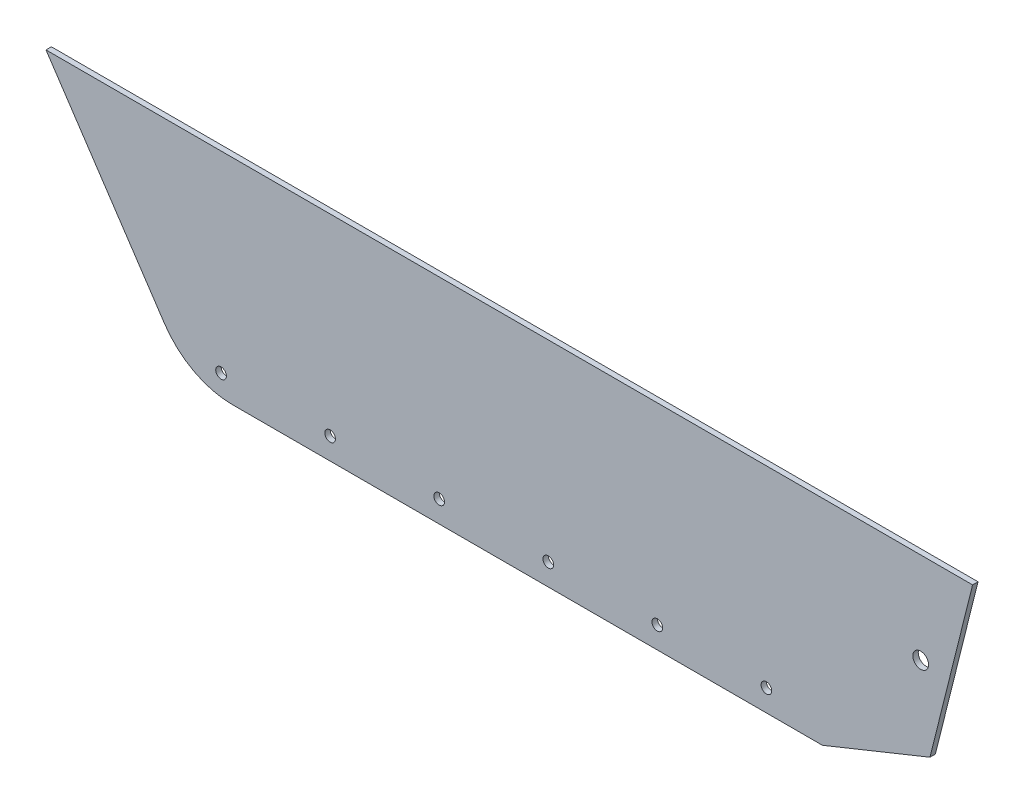
ISO-10303-21;
HEADER;
FILE_DESCRIPTION(('STEP AP214'),'2;1');
FILE_NAME('part.step','',(''),(''),'','','');
FILE_SCHEMA(('AUTOMOTIVE_DESIGN { 1 0 10303 214 1 1 1 1 }'));
ENDSEC;
DATA;
#1=APPLICATION_CONTEXT('core data for automotive mechanical design processes');
#2=APPLICATION_PROTOCOL_DEFINITION('international standard','automotive_design',2000,#1);
#3=PRODUCT_CONTEXT('',#1,'mechanical');
#4=PRODUCT('Part','Part','',(#3));
#5=PRODUCT_RELATED_PRODUCT_CATEGORY('part','',(#4));
#6=PRODUCT_DEFINITION_FORMATION('','',#4);
#7=PRODUCT_DEFINITION_CONTEXT('part definition',#1,'design');
#8=PRODUCT_DEFINITION('design','',#6,#7);
#9=PRODUCT_DEFINITION_SHAPE('','',#8);
#10=(LENGTH_UNIT() NAMED_UNIT(*) SI_UNIT(.MILLI.,.METRE.));
#11=(NAMED_UNIT(*) PLANE_ANGLE_UNIT() SI_UNIT($,.RADIAN.));
#12=(NAMED_UNIT(*) SI_UNIT($,.STERADIAN.) SOLID_ANGLE_UNIT());
#13=UNCERTAINTY_MEASURE_WITH_UNIT(LENGTH_MEASURE(1.E-05),#10,'distance_accuracy_value','');
#14=(GEOMETRIC_REPRESENTATION_CONTEXT(3) GLOBAL_UNCERTAINTY_ASSIGNED_CONTEXT((#13)) GLOBAL_UNIT_ASSIGNED_CONTEXT((#10,
#11,#12)) REPRESENTATION_CONTEXT('',''));
#15=CARTESIAN_POINT('',(0.,0.,0.));
#16=DIRECTION('',(0.,0.,1.));
#17=DIRECTION('',(1.,0.,0.));
#18=AXIS2_PLACEMENT_3D('',#15,#16,#17);
#19=CARTESIAN_POINT('',(-31.8794117647059,-96.6490196078432,3.175));
#20=DIRECTION('',(0.,1.,0.));
#21=DIRECTION('',(-1.,0.,0.));
#22=AXIS2_PLACEMENT_3D('',#19,#20,#21);
#23=PLANE('',#22);
#24=DIRECTION('',(1.,0.,0.));
#25=VECTOR('',#24,1.);
#26=CARTESIAN_POINT('',(-31.8794117647059,-96.6490196078432,0.));
#27=LINE('',#26,#25);
#28=CARTESIAN_POINT('',(-6.19059135728281,-96.6490196078432,0.));
#29=VERTEX_POINT('',#28);
#30=CARTESIAN_POINT('',(340.005873473177,-96.6490196078432,0.));
#31=VERTEX_POINT('',#30);
#32=EDGE_CURVE('E135',#29,#31,#27,.T.);
#33=ORIENTED_EDGE('',*,*,#32,.T.);
#34=DIRECTION('',(0.,0.,1.));
#35=VECTOR('',#34,1.);
#36=CARTESIAN_POINT('',(340.005873473177,-96.6490196078432,-6.825));
#37=LINE('',#36,#35);
#38=CARTESIAN_POINT('',(340.005873473177,-96.6490196078432,3.175));
#39=VERTEX_POINT('',#38);
#40=EDGE_CURVE('E62',#31,#39,#37,.T.);
#41=ORIENTED_EDGE('',*,*,#40,.T.);
#42=DIRECTION('',(1.,0.,0.));
#43=VECTOR('',#42,1.);
#44=CARTESIAN_POINT('',(-31.8794117647059,-96.6490196078432,3.175));
#45=LINE('',#44,#43);
#46=CARTESIAN_POINT('',(-6.19059135728281,-96.6490196078432,3.175));
#47=VERTEX_POINT('',#46);
#48=EDGE_CURVE('E119',#47,#39,#45,.T.);
#49=ORIENTED_EDGE('',*,*,#48,.F.);
#50=DIRECTION('',(0.,0.,-1.));
#51=VECTOR('',#50,1.);
#52=CARTESIAN_POINT('',(-6.19059135728281,-96.6490196078432,0.));
#53=LINE('',#52,#51);
#54=EDGE_CURVE('E108',#47,#29,#53,.T.);
#55=ORIENTED_EDGE('',*,*,#54,.T.);
#56=EDGE_LOOP('',(#33,#41,#49,#55));
#57=FACE_BOUND('',#56,.T.);
#58=ADVANCED_FACE('F47',(#57),#23,.F.);
#59=CARTESIAN_POINT('',(428.120588235294,28.9396179466764,3.175));
#60=DIRECTION('',(0.970193019893108,-0.242333456523632,0.));
#61=DIRECTION('',(0.242333456523632,0.970193019893108,0.));
#62=AXIS2_PLACEMENT_3D('',#59,#60,#61);
#63=PLANE('',#62);
#64=DIRECTION('',(-0.242333456523632,-0.970193019893108,0.));
#65=VECTOR('',#64,1.);
#66=CARTESIAN_POINT('',(428.120588235294,28.9396179466764,0.));
#67=LINE('',#66,#65);
#68=CARTESIAN_POINT('',(428.120588235294,28.9396179466764,0.));
#69=VERTEX_POINT('',#68);
#70=CARTESIAN_POINT('',(403.120588235294,-71.1490196078431,0.));
#71=VERTEX_POINT('',#70);
#72=EDGE_CURVE('E139',#69,#71,#67,.T.);
#73=ORIENTED_EDGE('',*,*,#72,.F.);
#74=DIRECTION('',(0.,0.,-1.));
#75=VECTOR('',#74,1.);
#76=CARTESIAN_POINT('',(428.120588235294,28.9396179466764,3.175));
#77=LINE('',#76,#75);
#78=CARTESIAN_POINT('',(428.120588235294,28.9396179466764,3.175));
#79=VERTEX_POINT('',#78);
#80=EDGE_CURVE('E109',#79,#69,#77,.T.);
#81=ORIENTED_EDGE('',*,*,#80,.F.);
#82=DIRECTION('',(-0.242333456523632,-0.970193019893108,0.));
#83=VECTOR('',#82,1.);
#84=CARTESIAN_POINT('',(428.120588235294,28.9396179466764,3.175));
#85=LINE('',#84,#83);
#86=CARTESIAN_POINT('',(403.120588235294,-71.1490196078431,3.175));
#87=VERTEX_POINT('',#86);
#88=EDGE_CURVE('E116',#79,#87,#85,.T.);
#89=ORIENTED_EDGE('',*,*,#88,.T.);
#90=DIRECTION('',(0.,0.,-1.));
#91=VECTOR('',#90,1.);
#92=CARTESIAN_POINT('',(403.120588235294,-71.1490196078431,3.175));
#93=LINE('',#92,#91);
#94=EDGE_CURVE('E99',#87,#71,#93,.T.);
#95=ORIENTED_EDGE('',*,*,#94,.T.);
#96=EDGE_LOOP('',(#73,#81,#89,#95));
#97=FACE_BOUND('',#96,.T.);
#98=ADVANCED_FACE('F123',(#97),#63,.T.);
#99=CARTESIAN_POINT('',(-115.605170134385,28.9396179466764,3.175));
#100=DIRECTION('',(0.,1.,0.));
#101=DIRECTION('',(-1.,0.,0.));
#102=AXIS2_PLACEMENT_3D('',#99,#100,#101);
#103=PLANE('',#102);
#104=DIRECTION('',(1.,0.,0.));
#105=VECTOR('',#104,1.);
#106=CARTESIAN_POINT('',(-115.605170134385,28.9396179466764,0.));
#107=LINE('',#106,#105);
#108=CARTESIAN_POINT('',(-115.605170134385,28.9396179466764,0.));
#109=VERTEX_POINT('',#108);
#110=EDGE_CURVE('E143',#109,#69,#107,.T.);
#111=ORIENTED_EDGE('',*,*,#110,.F.);
#112=DIRECTION('',(0.,0.,-1.));
#113=VECTOR('',#112,1.);
#114=CARTESIAN_POINT('',(-115.605170134385,28.9396179466764,3.175));
#115=LINE('',#114,#113);
#116=CARTESIAN_POINT('',(-115.605170134385,28.9396179466764,3.175));
#117=VERTEX_POINT('',#116);
#118=EDGE_CURVE('E129',#117,#109,#115,.T.);
#119=ORIENTED_EDGE('',*,*,#118,.F.);
#120=DIRECTION('',(1.,0.,0.));
#121=VECTOR('',#120,1.);
#122=CARTESIAN_POINT('',(-115.605170134385,28.9396179466764,3.175));
#123=LINE('',#122,#121);
#124=EDGE_CURVE('E125',#117,#79,#123,.T.);
#125=ORIENTED_EDGE('',*,*,#124,.T.);
#126=ORIENTED_EDGE('',*,*,#80,.T.);
#127=EDGE_LOOP('',(#111,#119,#125,#126));
#128=FACE_BOUND('',#127,.T.);
#129=ADVANCED_FACE('F175',(#128),#103,.T.);
#130=CARTESIAN_POINT('',(-98.8794117647059,3.85098039215685,3.175));
#131=DIRECTION('',(-0.832050294337848,-0.554700196225223,0.));
#132=DIRECTION('',(0.554700196225223,-0.832050294337848,0.));
#133=AXIS2_PLACEMENT_3D('',#130,#131,#132);
#134=PLANE('',#133);
#135=DIRECTION('',(-0.554700196225223,0.832050294337848,0.));
#136=VECTOR('',#135,1.);
#137=CARTESIAN_POINT('',(-98.8794117647059,3.85098039215685,0.));
#138=LINE('',#137,#136);
#139=CARTESIAN_POINT('',(-46.1290054854995,-75.2746290266539,0.));
#140=VERTEX_POINT('',#139);
#141=EDGE_CURVE('E147',#140,#109,#138,.T.);
#142=ORIENTED_EDGE('',*,*,#141,.F.);
#143=DIRECTION('',(0.,0.,-1.));
#144=VECTOR('',#143,1.);
#145=CARTESIAN_POINT('',(-46.1290054854995,-75.2746290266539,3.175));
#146=LINE('',#145,#144);
#147=CARTESIAN_POINT('',(-46.129005485499,-75.2746290266536,3.175));
#148=VERTEX_POINT('',#147);
#149=EDGE_CURVE('E70',#140,#148,#146,.F.);
#150=ORIENTED_EDGE('',*,*,#149,.T.);
#151=DIRECTION('',(0.554700196225229,-0.832050294337844,0.));
#152=VECTOR('',#151,1.);
#153=CARTESIAN_POINT('',(-98.8794117647059,3.85098039215685,3.175));
#154=LINE('',#153,#152);
#155=EDGE_CURVE('E131',#117,#148,#154,.T.);
#156=ORIENTED_EDGE('',*,*,#155,.F.);
#157=ORIENTED_EDGE('',*,*,#118,.T.);
#158=EDGE_LOOP('',(#142,#150,#156,#157));
#159=FACE_BOUND('',#158,.T.);
#160=ADVANCED_FACE('F171',(#159),#134,.T.);
#161=CARTESIAN_POINT('',(0.,0.,3.175));
#162=DIRECTION('',(0.,0.,-1.));
#163=DIRECTION('',(-1.,0.,0.));
#164=AXIS2_PLACEMENT_3D('',#161,#162,#163);
#165=PLANE('',#164);
#166=CARTESIAN_POINT('',(397.677759779101,-24.6104058558157,3.175));
#167=DIRECTION('',(0.,0.,1.));
#168=DIRECTION('',(1.,0.,0.));
#169=AXIS2_PLACEMENT_3D('',#166,#167,#168);
#170=CIRCLE('',#169,4.62499999999997);
#171=CARTESIAN_POINT('',(402.302759779101,-24.6104058558157,3.175));
#172=VERTEX_POINT('',#171);
#173=EDGE_CURVE('E121',#172,#172,#170,.T.);
#174=ORIENTED_EDGE('',*,*,#173,.F.);
#175=EDGE_LOOP('',(#174));
#176=FACE_BOUND('',#175,.T.);
#177=CARTESIAN_POINT('',(-12.8794117647059,-83.8990196078432,3.175));
#178=DIRECTION('',(0.,0.,1.));
#179=DIRECTION('',(1.,0.,0.));
#180=AXIS2_PLACEMENT_3D('',#177,#178,#179);
#181=CIRCLE('',#180,3.125);
#182=CARTESIAN_POINT('',(-9.75441176470592,-83.8990196078432,3.175));
#183=VERTEX_POINT('',#182);
#184=EDGE_CURVE('E140',#183,#183,#181,.T.);
#185=ORIENTED_EDGE('',*,*,#184,.F.);
#186=EDGE_LOOP('',(#185));
#187=FACE_BOUND('',#186,.T.);
#188=CARTESIAN_POINT('',(51.1205882352941,-83.8990196078433,3.175));
#189=DIRECTION('',(0.,0.,1.));
#190=DIRECTION('',(1.,0.,0.));
#191=AXIS2_PLACEMENT_3D('',#188,#189,#190);
#192=CIRCLE('',#191,3.125);
#193=CARTESIAN_POINT('',(54.2455882352941,-83.8990196078433,3.175));
#194=VERTEX_POINT('',#193);
#195=EDGE_CURVE('E343',#194,#194,#192,.T.);
#196=ORIENTED_EDGE('',*,*,#195,.F.);
#197=EDGE_LOOP('',(#196));
#198=FACE_BOUND('',#197,.T.);
#199=CARTESIAN_POINT('',(115.120588235294,-83.8990196078432,3.175));
#200=DIRECTION('',(0.,0.,1.));
#201=DIRECTION('',(1.,0.,0.));
#202=AXIS2_PLACEMENT_3D('',#199,#200,#201);
#203=CIRCLE('',#202,3.125);
#204=CARTESIAN_POINT('',(118.245588235294,-83.8990196078432,3.175));
#205=VERTEX_POINT('',#204);
#206=EDGE_CURVE('E351',#205,#205,#203,.T.);
#207=ORIENTED_EDGE('',*,*,#206,.F.);
#208=EDGE_LOOP('',(#207));
#209=FACE_BOUND('',#208,.T.);
#210=CARTESIAN_POINT('',(179.120588235294,-83.8990196078432,3.175));
#211=DIRECTION('',(0.,0.,1.));
#212=DIRECTION('',(1.,0.,0.));
#213=AXIS2_PLACEMENT_3D('',#210,#211,#212);
#214=CIRCLE('',#213,3.125);
#215=CARTESIAN_POINT('',(182.245588235294,-83.8990196078432,3.175));
#216=VERTEX_POINT('',#215);
#217=EDGE_CURVE('E359',#216,#216,#214,.T.);
#218=ORIENTED_EDGE('',*,*,#217,.F.);
#219=EDGE_LOOP('',(#218));
#220=FACE_BOUND('',#219,.T.);
#221=CARTESIAN_POINT('',(243.120588235294,-83.8990196078432,3.175));
#222=DIRECTION('',(0.,0.,1.));
#223=DIRECTION('',(1.,0.,0.));
#224=AXIS2_PLACEMENT_3D('',#221,#222,#223);
#225=CIRCLE('',#224,3.125);
#226=CARTESIAN_POINT('',(246.245588235294,-83.8990196078432,3.175));
#227=VERTEX_POINT('',#226);
#228=EDGE_CURVE('E322',#227,#227,#225,.T.);
#229=ORIENTED_EDGE('',*,*,#228,.F.);
#230=EDGE_LOOP('',(#229));
#231=FACE_BOUND('',#230,.T.);
#232=CARTESIAN_POINT('',(307.120588235294,-83.8990196078432,3.175));
#233=DIRECTION('',(0.,0.,1.));
#234=DIRECTION('',(1.,0.,0.));
#235=AXIS2_PLACEMENT_3D('',#232,#233,#234);
#236=CIRCLE('',#235,3.125);
#237=CARTESIAN_POINT('',(310.245588235294,-83.8990196078432,3.175));
#238=VERTEX_POINT('',#237);
#239=EDGE_CURVE('E316',#238,#238,#236,.T.);
#240=ORIENTED_EDGE('',*,*,#239,.F.);
#241=EDGE_LOOP('',(#240));
#242=FACE_BOUND('',#241,.T.);
#243=ORIENTED_EDGE('',*,*,#48,.T.);
#244=DIRECTION('',(-0.92718385456679,-0.374606593415906,0.));
#245=VECTOR('',#244,1.);
#246=CARTESIAN_POINT('',(403.120588235294,-71.1490196078431,3.175));
#247=LINE('',#246,#245);
#248=EDGE_CURVE('E102',#87,#39,#247,.T.);
#249=ORIENTED_EDGE('',*,*,#248,.F.);
#250=ORIENTED_EDGE('',*,*,#88,.F.);
#251=ORIENTED_EDGE('',*,*,#124,.F.);
#252=ORIENTED_EDGE('',*,*,#155,.T.);
#253=CARTESIAN_POINT('',(-6.19059135728282,-48.6490196078432,3.175));
#254=DIRECTION('',(0.,0.,-1.));
#255=DIRECTION('',(-1.,0.,0.));
#256=AXIS2_PLACEMENT_3D('',#253,#254,#255);
#257=CIRCLE('',#256,48.);
#258=EDGE_CURVE('E56',#148,#47,#257,.F.);
#259=ORIENTED_EDGE('',*,*,#258,.T.);
#260=EDGE_LOOP('',(#243,#249,#250,#251,#252,#259));
#261=FACE_BOUND('',#260,.T.);
#262=ADVANCED_FACE('F114',(#176,#187,#198,#209,#220,#231,#242,#261),#165,.F.);
#263=CARTESIAN_POINT('',(0.,0.,0.));
#264=DIRECTION('',(0.,0.,-1.));
#265=DIRECTION('',(-1.,0.,0.));
#266=AXIS2_PLACEMENT_3D('',#263,#264,#265);
#267=PLANE('',#266);
#268=CARTESIAN_POINT('',(397.677759779101,-24.6104058558157,0.));
#269=DIRECTION('',(0.,0.,-1.));
#270=DIRECTION('',(-1.,0.,0.));
#271=AXIS2_PLACEMENT_3D('',#268,#269,#270);
#272=CIRCLE('',#271,4.62499999999997);
#273=CARTESIAN_POINT('',(393.052759779101,-24.6104058558157,0.));
#274=VERTEX_POINT('',#273);
#275=EDGE_CURVE('E370',#274,#274,#272,.F.);
#276=ORIENTED_EDGE('',*,*,#275,.T.);
#277=EDGE_LOOP('',(#276));
#278=FACE_BOUND('',#277,.T.);
#279=DIRECTION('',(0.92718385456679,0.374606593415906,0.));
#280=VECTOR('',#279,1.);
#281=CARTESIAN_POINT('',(81.2820834011268,-201.180216044419,0.));
#282=LINE('',#281,#280);
#283=EDGE_CURVE('E11',#31,#71,#282,.T.);
#284=ORIENTED_EDGE('',*,*,#283,.F.);
#285=ORIENTED_EDGE('',*,*,#32,.F.);
#286=CARTESIAN_POINT('',(-6.19059135728282,-48.6490196078432,0.));
#287=DIRECTION('',(0.,0.,-1.));
#288=DIRECTION('',(-1.,0.,0.));
#289=AXIS2_PLACEMENT_3D('',#286,#287,#288);
#290=CIRCLE('',#289,48.);
#291=EDGE_CURVE('E158',#29,#140,#290,.T.);
#292=ORIENTED_EDGE('',*,*,#291,.T.);
#293=ORIENTED_EDGE('',*,*,#141,.T.);
#294=ORIENTED_EDGE('',*,*,#110,.T.);
#295=ORIENTED_EDGE('',*,*,#72,.T.);
#296=EDGE_LOOP('',(#284,#285,#292,#293,#294,#295));
#297=FACE_BOUND('',#296,.T.);
#298=CARTESIAN_POINT('',(-12.8794117647059,-83.8990196078432,0.));
#299=DIRECTION('',(0.,0.,1.));
#300=DIRECTION('',(1.,0.,0.));
#301=AXIS2_PLACEMENT_3D('',#298,#299,#300);
#302=CIRCLE('',#301,3.125);
#303=CARTESIAN_POINT('',(-9.75441176470592,-83.8990196078432,0.));
#304=VERTEX_POINT('',#303);
#305=EDGE_CURVE('E335',#304,#304,#302,.T.);
#306=ORIENTED_EDGE('',*,*,#305,.T.);
#307=EDGE_LOOP('',(#306));
#308=FACE_BOUND('',#307,.T.);
#309=CARTESIAN_POINT('',(51.1205882352941,-83.8990196078433,0.));
#310=DIRECTION('',(0.,0.,1.));
#311=DIRECTION('',(1.,0.,0.));
#312=AXIS2_PLACEMENT_3D('',#309,#310,#311);
#313=CIRCLE('',#312,3.125);
#314=CARTESIAN_POINT('',(54.2455882352941,-83.8990196078433,0.));
#315=VERTEX_POINT('',#314);
#316=EDGE_CURVE('E339',#315,#315,#313,.T.);
#317=ORIENTED_EDGE('',*,*,#316,.T.);
#318=EDGE_LOOP('',(#317));
#319=FACE_BOUND('',#318,.T.);
#320=CARTESIAN_POINT('',(115.120588235294,-83.8990196078432,0.));
#321=DIRECTION('',(0.,0.,1.));
#322=DIRECTION('',(1.,0.,0.));
#323=AXIS2_PLACEMENT_3D('',#320,#321,#322);
#324=CIRCLE('',#323,3.125);
#325=CARTESIAN_POINT('',(118.245588235294,-83.8990196078432,0.));
#326=VERTEX_POINT('',#325);
#327=EDGE_CURVE('E347',#326,#326,#324,.T.);
#328=ORIENTED_EDGE('',*,*,#327,.T.);
#329=EDGE_LOOP('',(#328));
#330=FACE_BOUND('',#329,.T.);
#331=CARTESIAN_POINT('',(179.120588235294,-83.8990196078432,0.));
#332=DIRECTION('',(0.,0.,1.));
#333=DIRECTION('',(1.,0.,0.));
#334=AXIS2_PLACEMENT_3D('',#331,#332,#333);
#335=CIRCLE('',#334,3.125);
#336=CARTESIAN_POINT('',(182.245588235294,-83.8990196078432,0.));
#337=VERTEX_POINT('',#336);
#338=EDGE_CURVE('E355',#337,#337,#335,.T.);
#339=ORIENTED_EDGE('',*,*,#338,.T.);
#340=EDGE_LOOP('',(#339));
#341=FACE_BOUND('',#340,.T.);
#342=CARTESIAN_POINT('',(243.120588235294,-83.8990196078432,0.));
#343=DIRECTION('',(0.,0.,1.));
#344=DIRECTION('',(1.,0.,0.));
#345=AXIS2_PLACEMENT_3D('',#342,#343,#344);
#346=CIRCLE('',#345,3.125);
#347=CARTESIAN_POINT('',(246.245588235294,-83.8990196078432,0.));
#348=VERTEX_POINT('',#347);
#349=EDGE_CURVE('E327',#348,#348,#346,.T.);
#350=ORIENTED_EDGE('',*,*,#349,.T.);
#351=EDGE_LOOP('',(#350));
#352=FACE_BOUND('',#351,.T.);
#353=CARTESIAN_POINT('',(307.120588235294,-83.8990196078432,0.));
#354=DIRECTION('',(0.,0.,1.));
#355=DIRECTION('',(1.,0.,0.));
#356=AXIS2_PLACEMENT_3D('',#353,#354,#355);
#357=CIRCLE('',#356,3.125);
#358=CARTESIAN_POINT('',(310.245588235294,-83.8990196078432,0.));
#359=VERTEX_POINT('',#358);
#360=EDGE_CURVE('E319',#359,#359,#357,.T.);
#361=ORIENTED_EDGE('',*,*,#360,.T.);
#362=EDGE_LOOP('',(#361));
#363=FACE_BOUND('',#362,.T.);
#364=ADVANCED_FACE('F169',(#278,#297,#308,#319,#330,#341,#352,#363),#267,.T.);
#365=CARTESIAN_POINT('',(307.120588235294,-83.8990196078432,3.175));
#366=DIRECTION('',(0.,0.,-1.));
#367=DIRECTION('',(-1.,0.,0.));
#368=AXIS2_PLACEMENT_3D('',#365,#366,#367);
#369=CYLINDRICAL_SURFACE('',#368,3.125);
#370=ORIENTED_EDGE('',*,*,#239,.T.);
#371=EDGE_LOOP('',(#370));
#372=FACE_BOUND('',#371,.T.);
#373=ORIENTED_EDGE('',*,*,#360,.F.);
#374=EDGE_LOOP('',(#373));
#375=FACE_BOUND('',#374,.T.);
#376=ADVANCED_FACE('F221',(#372,#375),#369,.F.);
#377=CARTESIAN_POINT('',(243.120588235294,-83.8990196078432,3.175));
#378=DIRECTION('',(0.,0.,-1.));
#379=DIRECTION('',(-1.,0.,0.));
#380=AXIS2_PLACEMENT_3D('',#377,#378,#379);
#381=CYLINDRICAL_SURFACE('',#380,3.125);
#382=ORIENTED_EDGE('',*,*,#228,.T.);
#383=EDGE_LOOP('',(#382));
#384=FACE_BOUND('',#383,.T.);
#385=ORIENTED_EDGE('',*,*,#349,.F.);
#386=EDGE_LOOP('',(#385));
#387=FACE_BOUND('',#386,.T.);
#388=ADVANCED_FACE('F273',(#384,#387),#381,.F.);
#389=CARTESIAN_POINT('',(179.120588235294,-83.8990196078432,3.175));
#390=DIRECTION('',(0.,0.,-1.));
#391=DIRECTION('',(-1.,0.,0.));
#392=AXIS2_PLACEMENT_3D('',#389,#390,#391);
#393=CYLINDRICAL_SURFACE('',#392,3.125);
#394=ORIENTED_EDGE('',*,*,#217,.T.);
#395=EDGE_LOOP('',(#394));
#396=FACE_BOUND('',#395,.T.);
#397=ORIENTED_EDGE('',*,*,#338,.F.);
#398=EDGE_LOOP('',(#397));
#399=FACE_BOUND('',#398,.T.);
#400=ADVANCED_FACE('F264',(#396,#399),#393,.F.);
#401=CARTESIAN_POINT('',(115.120588235294,-83.8990196078432,3.175));
#402=DIRECTION('',(0.,0.,-1.));
#403=DIRECTION('',(-1.,0.,0.));
#404=AXIS2_PLACEMENT_3D('',#401,#402,#403);
#405=CYLINDRICAL_SURFACE('',#404,3.125);
#406=ORIENTED_EDGE('',*,*,#206,.T.);
#407=EDGE_LOOP('',(#406));
#408=FACE_BOUND('',#407,.T.);
#409=ORIENTED_EDGE('',*,*,#327,.F.);
#410=EDGE_LOOP('',(#409));
#411=FACE_BOUND('',#410,.T.);
#412=ADVANCED_FACE('F255',(#408,#411),#405,.F.);
#413=CARTESIAN_POINT('',(51.1205882352941,-83.8990196078433,3.175));
#414=DIRECTION('',(0.,0.,-1.));
#415=DIRECTION('',(-1.,0.,0.));
#416=AXIS2_PLACEMENT_3D('',#413,#414,#415);
#417=CYLINDRICAL_SURFACE('',#416,3.125);
#418=ORIENTED_EDGE('',*,*,#195,.T.);
#419=EDGE_LOOP('',(#418));
#420=FACE_BOUND('',#419,.T.);
#421=ORIENTED_EDGE('',*,*,#316,.F.);
#422=EDGE_LOOP('',(#421));
#423=FACE_BOUND('',#422,.T.);
#424=ADVANCED_FACE('F246',(#420,#423),#417,.F.);
#425=CARTESIAN_POINT('',(-12.8794117647059,-83.8990196078432,3.175));
#426=DIRECTION('',(0.,0.,-1.));
#427=DIRECTION('',(-1.,0.,0.));
#428=AXIS2_PLACEMENT_3D('',#425,#426,#427);
#429=CYLINDRICAL_SURFACE('',#428,3.125);
#430=ORIENTED_EDGE('',*,*,#184,.T.);
#431=EDGE_LOOP('',(#430));
#432=FACE_BOUND('',#431,.T.);
#433=ORIENTED_EDGE('',*,*,#305,.F.);
#434=EDGE_LOOP('',(#433));
#435=FACE_BOUND('',#434,.T.);
#436=ADVANCED_FACE('F239',(#432,#435),#429,.F.);
#437=CARTESIAN_POINT('',(-6.19059135728282,-48.6490196078432,3.175));
#438=DIRECTION('',(0.,0.,1.));
#439=DIRECTION('',(1.,0.,0.));
#440=AXIS2_PLACEMENT_3D('',#437,#438,#439);
#441=CYLINDRICAL_SURFACE('',#440,48.);
#442=ORIENTED_EDGE('',*,*,#258,.F.);
#443=ORIENTED_EDGE('',*,*,#149,.F.);
#444=ORIENTED_EDGE('',*,*,#291,.F.);
#445=ORIENTED_EDGE('',*,*,#54,.F.);
#446=EDGE_LOOP('',(#442,#443,#444,#445));
#447=FACE_BOUND('',#446,.T.);
#448=ADVANCED_FACE('F49',(#447),#441,.T.);
#449=CARTESIAN_POINT('',(403.120588235294,-71.1490196078431,-6.825));
#450=DIRECTION('',(-0.374606593415906,0.92718385456679,0.));
#451=DIRECTION('',(-0.92718385456679,-0.374606593415906,0.));
#452=AXIS2_PLACEMENT_3D('',#449,#450,#451);
#453=PLANE('',#452);
#454=ORIENTED_EDGE('',*,*,#283,.T.);
#455=ORIENTED_EDGE('',*,*,#94,.F.);
#456=ORIENTED_EDGE('',*,*,#248,.T.);
#457=ORIENTED_EDGE('',*,*,#40,.F.);
#458=EDGE_LOOP('',(#454,#455,#456,#457));
#459=FACE_BOUND('',#458,.T.);
#460=ADVANCED_FACE('F101',(#459),#453,.F.);
#461=CARTESIAN_POINT('',(397.677759779101,-24.6104058558157,-0.00100000000000013));
#462=DIRECTION('',(0.,0.,1.));
#463=DIRECTION('',(1.,0.,0.));
#464=AXIS2_PLACEMENT_3D('',#461,#462,#463);
#465=CYLINDRICAL_SURFACE('',#464,4.62499999999997);
#466=ORIENTED_EDGE('',*,*,#275,.F.);
#467=EDGE_LOOP('',(#466));
#468=FACE_BOUND('',#467,.T.);
#469=ORIENTED_EDGE('',*,*,#173,.T.);
#470=EDGE_LOOP('',(#469));
#471=FACE_BOUND('',#470,.T.);
#472=ADVANCED_FACE('F203',(#468,#471),#465,.F.);
#473=CLOSED_SHELL('',(#58,#98,#129,#160,#262,#364,#376,#388,#400,#412,#424,#436,#448,#460,#472));
#474=MANIFOLD_SOLID_BREP('B2',#473);
#475=ADVANCED_BREP_SHAPE_REPRESENTATION('',(#18,#474),#14);
#476=SHAPE_DEFINITION_REPRESENTATION(#9,#475);
ENDSEC;
END-ISO-10303-21;
